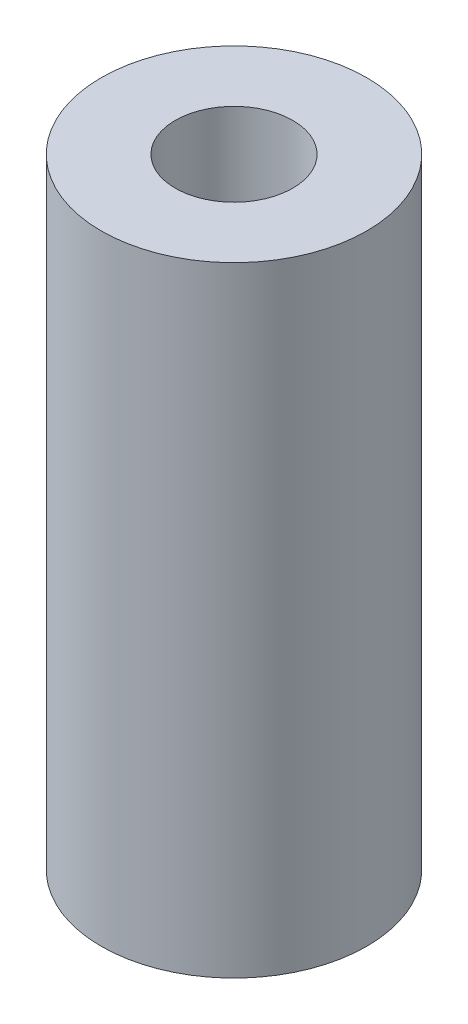
ISO-10303-21;
HEADER;
FILE_DESCRIPTION(('STEP AP214'),'2;1');
FILE_NAME('part.step','',(''),(''),'','','');
FILE_SCHEMA(('AUTOMOTIVE_DESIGN { 1 0 10303 214 1 1 1 1 }'));
ENDSEC;
DATA;
#1=APPLICATION_CONTEXT('core data for automotive mechanical design processes');
#2=APPLICATION_PROTOCOL_DEFINITION('international standard','automotive_design',2000,#1);
#3=PRODUCT_CONTEXT('',#1,'mechanical');
#4=PRODUCT('Part','Part','',(#3));
#5=PRODUCT_RELATED_PRODUCT_CATEGORY('part','',(#4));
#6=PRODUCT_DEFINITION_FORMATION('','',#4);
#7=PRODUCT_DEFINITION_CONTEXT('part definition',#1,'design');
#8=PRODUCT_DEFINITION('design','',#6,#7);
#9=PRODUCT_DEFINITION_SHAPE('','',#8);
#10=(LENGTH_UNIT() NAMED_UNIT(*) SI_UNIT(.MILLI.,.METRE.));
#11=(NAMED_UNIT(*) PLANE_ANGLE_UNIT() SI_UNIT($,.RADIAN.));
#12=(NAMED_UNIT(*) SI_UNIT($,.STERADIAN.) SOLID_ANGLE_UNIT());
#13=UNCERTAINTY_MEASURE_WITH_UNIT(LENGTH_MEASURE(1.E-05),#10,'distance_accuracy_value','');
#14=(GEOMETRIC_REPRESENTATION_CONTEXT(3) GLOBAL_UNCERTAINTY_ASSIGNED_CONTEXT((#13)) GLOBAL_UNIT_ASSIGNED_CONTEXT((#10,
#11,#12)) REPRESENTATION_CONTEXT('',''));
#15=CARTESIAN_POINT('',(0.,0.,0.));
#16=DIRECTION('',(0.,0.,1.));
#17=DIRECTION('',(1.,0.,0.));
#18=AXIS2_PLACEMENT_3D('',#15,#16,#17);
#19=CARTESIAN_POINT('',(0.,11.1125,0.));
#20=DIRECTION('',(0.,-1.,0.));
#21=DIRECTION('',(0.,0.,-1.));
#22=AXIS2_PLACEMENT_3D('',#19,#20,#21);
#23=CYLINDRICAL_SURFACE('',#22,2.1082);
#24=CARTESIAN_POINT('',(0.,-11.1125,0.));
#25=DIRECTION('',(0.,-1.,0.));
#26=DIRECTION('',(0.,0.,-1.));
#27=AXIS2_PLACEMENT_3D('',#24,#25,#26);
#28=CIRCLE('',#27,2.1082);
#29=CARTESIAN_POINT('',(0.,-11.1125,-2.1082));
#30=VERTEX_POINT('',#29);
#31=EDGE_CURVE('E26',#30,#30,#28,.T.);
#32=ORIENTED_EDGE('',*,*,#31,.T.);
#33=EDGE_LOOP('',(#32));
#34=FACE_BOUND('',#33,.T.);
#35=CARTESIAN_POINT('',(0.,11.1125,0.));
#36=DIRECTION('',(0.,-1.,0.));
#37=DIRECTION('',(0.,0.,-1.));
#38=AXIS2_PLACEMENT_3D('',#35,#36,#37);
#39=CIRCLE('',#38,2.1082);
#40=CARTESIAN_POINT('',(0.,11.1125,-2.1082));
#41=VERTEX_POINT('',#40);
#42=EDGE_CURVE('E17',#41,#41,#39,.T.);
#43=ORIENTED_EDGE('',*,*,#42,.F.);
#44=EDGE_LOOP('',(#43));
#45=FACE_BOUND('',#44,.T.);
#46=ADVANCED_FACE('F14',(#34,#45),#23,.F.);
#47=CARTESIAN_POINT('',(0.,11.1125,0.));
#48=DIRECTION('',(0.,1.,0.));
#49=DIRECTION('',(0.,0.,1.));
#50=AXIS2_PLACEMENT_3D('',#47,#48,#49);
#51=PLANE('',#50);
#52=ORIENTED_EDGE('',*,*,#42,.T.);
#53=EDGE_LOOP('',(#52));
#54=FACE_BOUND('',#53,.T.);
#55=CARTESIAN_POINT('',(0.,11.1125,0.));
#56=DIRECTION('',(0.,-1.,0.));
#57=DIRECTION('',(0.,0.,-1.));
#58=AXIS2_PLACEMENT_3D('',#55,#56,#57);
#59=CIRCLE('',#58,4.7625);
#60=CARTESIAN_POINT('',(0.,11.1125,-4.7625));
#61=VERTEX_POINT('',#60);
#62=EDGE_CURVE('E21',#61,#61,#59,.T.);
#63=ORIENTED_EDGE('',*,*,#62,.F.);
#64=EDGE_LOOP('',(#63));
#65=FACE_BOUND('',#64,.T.);
#66=ADVANCED_FACE('F34',(#54,#65),#51,.T.);
#67=CARTESIAN_POINT('',(0.,-11.1125,0.));
#68=DIRECTION('',(0.,1.,0.));
#69=DIRECTION('',(0.,0.,1.));
#70=AXIS2_PLACEMENT_3D('',#67,#68,#69);
#71=PLANE('',#70);
#72=ORIENTED_EDGE('',*,*,#31,.F.);
#73=EDGE_LOOP('',(#72));
#74=FACE_BOUND('',#73,.T.);
#75=CARTESIAN_POINT('',(0.,-11.1125,0.));
#76=DIRECTION('',(0.,-1.,0.));
#77=DIRECTION('',(0.,0.,-1.));
#78=AXIS2_PLACEMENT_3D('',#75,#76,#77);
#79=CIRCLE('',#78,4.7625);
#80=CARTESIAN_POINT('',(0.,-11.1125,-4.7625));
#81=VERTEX_POINT('',#80);
#82=EDGE_CURVE('E10',#81,#81,#79,.F.);
#83=ORIENTED_EDGE('',*,*,#82,.F.);
#84=EDGE_LOOP('',(#83));
#85=FACE_BOUND('',#84,.T.);
#86=ADVANCED_FACE('F42',(#74,#85),#71,.F.);
#87=CARTESIAN_POINT('',(0.,11.1125,0.));
#88=DIRECTION('',(0.,-1.,0.));
#89=DIRECTION('',(0.,0.,-1.));
#90=AXIS2_PLACEMENT_3D('',#87,#88,#89);
#91=CYLINDRICAL_SURFACE('',#90,4.7625);
#92=ORIENTED_EDGE('',*,*,#82,.T.);
#93=EDGE_LOOP('',(#92));
#94=FACE_BOUND('',#93,.T.);
#95=ORIENTED_EDGE('',*,*,#62,.T.);
#96=EDGE_LOOP('',(#95));
#97=FACE_BOUND('',#96,.T.);
#98=ADVANCED_FACE('F43',(#94,#97),#91,.T.);
#99=CLOSED_SHELL('',(#46,#66,#86,#98));
#100=MANIFOLD_SOLID_BREP('B1',#99);
#101=ADVANCED_BREP_SHAPE_REPRESENTATION('',(#18,#100),#14);
#102=SHAPE_DEFINITION_REPRESENTATION(#9,#101);
ENDSEC;
END-ISO-10303-21;
